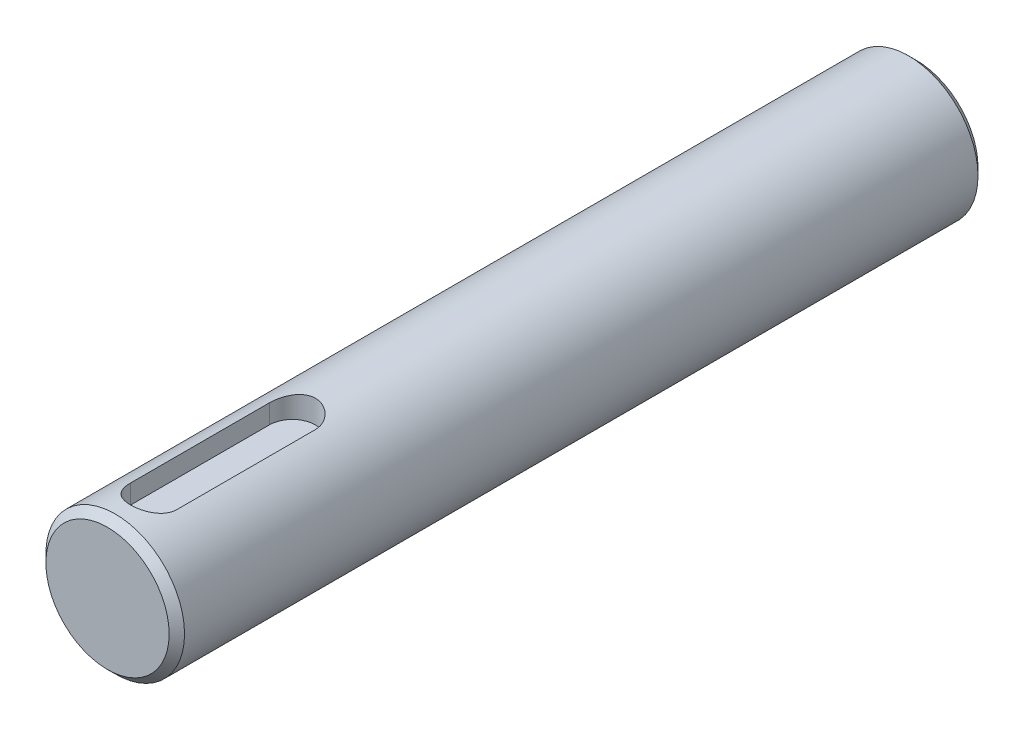
ISO-10303-21;
HEADER;
FILE_DESCRIPTION(('STEP AP214'),'2;1');
FILE_NAME('part.step','',(''),(''),'','','');
FILE_SCHEMA(('AUTOMOTIVE_DESIGN { 1 0 10303 214 1 1 1 1 }'));
ENDSEC;
DATA;
#1=APPLICATION_CONTEXT('core data for automotive mechanical design processes');
#2=APPLICATION_PROTOCOL_DEFINITION('international standard','automotive_design',2000,#1);
#3=PRODUCT_CONTEXT('',#1,'mechanical');
#4=PRODUCT('Part','Part','',(#3));
#5=PRODUCT_RELATED_PRODUCT_CATEGORY('part','',(#4));
#6=PRODUCT_DEFINITION_FORMATION('','',#4);
#7=PRODUCT_DEFINITION_CONTEXT('part definition',#1,'design');
#8=PRODUCT_DEFINITION('design','',#6,#7);
#9=PRODUCT_DEFINITION_SHAPE('','',#8);
#10=(LENGTH_UNIT() NAMED_UNIT(*) SI_UNIT(.MILLI.,.METRE.));
#11=(NAMED_UNIT(*) PLANE_ANGLE_UNIT() SI_UNIT($,.RADIAN.));
#12=(NAMED_UNIT(*) SI_UNIT($,.STERADIAN.) SOLID_ANGLE_UNIT());
#13=UNCERTAINTY_MEASURE_WITH_UNIT(LENGTH_MEASURE(1.E-05),#10,'distance_accuracy_value','');
#14=(GEOMETRIC_REPRESENTATION_CONTEXT(3) GLOBAL_UNCERTAINTY_ASSIGNED_CONTEXT((#13)) GLOBAL_UNIT_ASSIGNED_CONTEXT((#10,
#11,#12)) REPRESENTATION_CONTEXT('',''));
#15=CARTESIAN_POINT('',(0.,0.,0.));
#16=DIRECTION('',(0.,0.,1.));
#17=DIRECTION('',(1.,0.,0.));
#18=AXIS2_PLACEMENT_3D('',#15,#16,#17);
#19=CARTESIAN_POINT('',(0.,0.,105.));
#20=DIRECTION('',(0.,0.,-1.));
#21=DIRECTION('',(-1.,0.,0.));
#22=AXIS2_PLACEMENT_3D('',#19,#20,#21);
#23=CYLINDRICAL_SURFACE('',#22,9.);
#24=CARTESIAN_POINT('',(0.,0.,0.999999999999973));
#25=DIRECTION('',(0.,0.,1.));
#26=DIRECTION('',(1.,0.,0.));
#27=AXIS2_PLACEMENT_3D('',#24,#25,#26);
#28=CIRCLE('',#27,9.);
#29=CARTESIAN_POINT('',(9.,0.,0.999999999999973));
#30=VERTEX_POINT('',#29);
#31=EDGE_CURVE('E128',#30,#30,#28,.T.);
#32=ORIENTED_EDGE('',*,*,#31,.T.);
#33=EDGE_LOOP('',(#32));
#34=FACE_BOUND('',#33,.T.);
#35=CARTESIAN_POINT('',(0.,0.,104.));
#36=DIRECTION('',(0.,0.,1.));
#37=DIRECTION('',(1.,0.,0.));
#38=AXIS2_PLACEMENT_3D('',#35,#36,#37);
#39=CIRCLE('',#38,9.);
#40=CARTESIAN_POINT('',(9.,0.,104.));
#41=VERTEX_POINT('',#40);
#42=EDGE_CURVE('E95',#41,#41,#39,.F.);
#43=ORIENTED_EDGE('',*,*,#42,.T.);
#44=EDGE_LOOP('',(#43));
#45=FACE_BOUND('',#44,.T.);
#46=CARTESIAN_POINT('',(-3.,8.48528137423857,99.));
#47=CARTESIAN_POINT('',(-3.00001078932486,8.48526831927789,99.0818484933844));
#48=CARTESIAN_POINT('',(-2.99665064665901,8.48646532685483,99.1636896896105));
#49=CARTESIAN_POINT('',(-2.98327254936564,8.49118228945209,99.3267372460191));
#50=CARTESIAN_POINT('',(-2.97325639196642,8.49470161740771,99.4079437715856));
#51=CARTESIAN_POINT('',(-2.94668951307354,8.50395246303008,99.5689085860254));
#52=CARTESIAN_POINT('',(-2.93015817315761,8.50967741820142,99.648670443061));
#53=CARTESIAN_POINT('',(-2.89073017236144,8.52315143887203,99.8064099222994));
#54=CARTESIAN_POINT('',(-2.8678332814324,8.53090057752397,99.884387479908));
#55=CARTESIAN_POINT('',(-2.7898986156743,8.55683928952694,100.114753895657));
#56=CARTESIAN_POINT('',(-2.72557700172275,8.57773492660859,100.263814988963));
#57=CARTESIAN_POINT('',(-2.57421340927529,8.62436440905027,100.549052173757));
#58=CARTESIAN_POINT('',(-2.4871574792233,8.65010122261302,100.685220282941));
#59=CARTESIAN_POINT('',(-2.28915595016085,8.70463418867365,100.94615148416));
#60=CARTESIAN_POINT('',(-2.17747541556634,8.73350627313643,101.070342171302));
#61=CARTESIAN_POINT('',(-1.93496485428979,8.79041552071283,101.2986205239));
#62=CARTESIAN_POINT('',(-1.80413142497752,8.81845253440363,101.402704609656));
#63=CARTESIAN_POINT('',(-1.52281106991367,8.87141647315468,101.59043786904));
#64=CARTESIAN_POINT('',(-1.37190030336069,8.8962431223892,101.673482769007));
#65=CARTESIAN_POINT('',(-1.05728771462316,8.9390882626048,101.812776939205));
#66=CARTESIAN_POINT('',(-0.893589817668319,8.95710883299482,101.869034394971));
#67=CARTESIAN_POINT('',(-0.564088045229084,8.98377213313373,101.951207130487));
#68=CARTESIAN_POINT('',(-0.398555505085337,8.99271926928151,101.978109801392));
#69=CARTESIAN_POINT('',(-0.0650969066624177,9.0013082524901,102.003948911842));
#70=CARTESIAN_POINT('',(0.102828571762974,9.00095231678788,102.002892015099));
#71=CARTESIAN_POINT('',(0.429311537733991,8.99118115872284,101.973467134069));
#72=CARTESIAN_POINT('',(0.587978116884625,8.98212182877037,101.946172035994));
#73=CARTESIAN_POINT('',(0.898332184121465,8.9564088159923,101.866820454108));
#74=CARTESIAN_POINT('',(1.05001928471038,8.93975471206725,101.814762597295));
#75=CARTESIAN_POINT('',(1.34445790368094,8.90027004455731,101.686735704865));
#76=CARTESIAN_POINT('',(1.48706564697704,8.8773611217211,101.610461165856));
#77=CARTESIAN_POINT('',(1.75777363724201,8.82775164383326,101.436420844795));
#78=CARTESIAN_POINT('',(1.88586992347829,8.80105005807909,101.338649216676));
#79=CARTESIAN_POINT('',(2.13029252762403,8.74518810577395,101.118984117542));
#80=CARTESIAN_POINT('',(2.24578277403273,8.71597116015319,100.996172948676));
#81=CARTESIAN_POINT('',(2.45481413464109,8.65942491449435,100.732685954708));
#82=CARTESIAN_POINT('',(2.5483481578384,8.63209622629495,100.592004380708));
#83=CARTESIAN_POINT('',(2.71201733554396,8.58210018141277,100.293919921764));
#84=CARTESIAN_POINT('',(2.78178668333576,8.55950759277136,100.136300848881));
#85=CARTESIAN_POINT('',(2.86551808116445,8.5316849132946,99.8923158654452));
#86=CARTESIAN_POINT('',(2.889939000529,8.52342263559069,99.8097432429298));
#87=CARTESIAN_POINT('',(2.9316254907929,8.50917513666655,99.6426296037896));
#88=CARTESIAN_POINT('',(2.94889432902108,8.50318887578236,99.5580895046639));
#89=CARTESIAN_POINT('',(2.97496555991273,8.49410161473166,99.3947667222494));
#90=CARTESIAN_POINT('',(2.98435073218189,8.49080270505212,99.3160871393639));
#91=CARTESIAN_POINT('',(2.99686829404165,8.48638843638536,99.1582744704951));
#92=CARTESIAN_POINT('',(3.0000087520931,8.48527025982562,99.0791421023582));
#93=CARTESIAN_POINT('',(3.,8.48528137423857,99.));
#94=B_SPLINE_CURVE_WITH_KNOTS('',3,(#46,#47,#48,#49,#50,#51,#52,#53,#54,#55,#56,#57,#58,#59,#60,
#61,#62,#63,#64,#65,#66,#67,#68,#69,#70,#71,#72,#73,#74,#75,#76,#77,#78,#79,#80,#81,#82,#83,#84,
#85,#86,#87,#88,#89,#90,#91,#92,#93),.UNSPECIFIED.,.F.,.F.,(4,2,2,2,2,2,2,2,2,2,2,2,2,2,2,2,2,2,
2,2,2,2,2,4),(0.,0.245455454206294,0.490844658508378,0.735509315314893,0.980182815366468,
1.46881220307906,1.95774215958629,2.46393436906068,2.97021661609276,3.48971320817339,
4.00905095381417,4.51032334200243,5.01147626109962,5.4929717741524,5.97449398742779,
6.46234978495937,6.9503384178434,7.46126084192184,7.97234804765762,8.49098011802155,
8.75020549988895,9.0093123272696,9.24695816264698,9.48429674853612),.UNSPECIFIED.);
#95=CARTESIAN_POINT('',(-3.,8.48528137423857,99.));
#96=VERTEX_POINT('',#95);
#97=CARTESIAN_POINT('',(3.,8.48528137423857,99.));
#98=VERTEX_POINT('',#97);
#99=EDGE_CURVE('E140',#96,#98,#94,.T.);
#100=ORIENTED_EDGE('',*,*,#99,.F.);
#101=DIRECTION('',(0.,0.,-1.));
#102=VECTOR('',#101,1.);
#103=CARTESIAN_POINT('',(-3.,8.48528137423857,105.));
#104=LINE('',#103,#102);
#105=CARTESIAN_POINT('',(-3.,8.48528137423857,81.));
#106=VERTEX_POINT('',#105);
#107=EDGE_CURVE('E11',#106,#96,#104,.F.);
#108=ORIENTED_EDGE('',*,*,#107,.F.);
#109=CARTESIAN_POINT('',(3.,8.48528137423857,81.));
#110=CARTESIAN_POINT('',(3.00001078932486,8.48526831927789,80.9181515066156));
#111=CARTESIAN_POINT('',(2.99665064665902,8.48646532685483,80.8363103103895));
#112=CARTESIAN_POINT('',(2.98327254936565,8.49118228945209,80.6732627539809));
#113=CARTESIAN_POINT('',(2.97325639196643,8.49470161740771,80.5920562284143));
#114=CARTESIAN_POINT('',(2.94668951307354,8.50395246303008,80.4310914139745));
#115=CARTESIAN_POINT('',(2.93015817315762,8.50967741820142,80.351329556939));
#116=CARTESIAN_POINT('',(2.89073017236145,8.52315143887203,80.1935900777006));
#117=CARTESIAN_POINT('',(2.86783328143241,8.53090057752397,80.115612520092));
#118=CARTESIAN_POINT('',(2.7898986156743,8.55683928952694,79.8852461043427));
#119=CARTESIAN_POINT('',(2.72557700172276,8.57773492660859,79.7361850110373));
#120=CARTESIAN_POINT('',(2.5742134092753,8.62436440905027,79.4509478262426));
#121=CARTESIAN_POINT('',(2.4871574792233,8.65010122261302,79.3147797170588));
#122=CARTESIAN_POINT('',(2.28915595016086,8.70463418867365,79.0538485158402));
#123=CARTESIAN_POINT('',(2.17747541556634,8.73350627313643,78.9296578286977));
#124=CARTESIAN_POINT('',(1.93496485428979,8.79041552071283,78.7013794761));
#125=CARTESIAN_POINT('',(1.80413142497752,8.81845253440362,78.5972953903439));
#126=CARTESIAN_POINT('',(1.52281106991368,8.87141647315468,78.4095621309602));
#127=CARTESIAN_POINT('',(1.37190030336069,8.8962431223892,78.3265172309932));
#128=CARTESIAN_POINT('',(1.05728771462316,8.9390882626048,78.1872230607945));
#129=CARTESIAN_POINT('',(0.893589817668321,8.95710883299482,78.1309656050291));
#130=CARTESIAN_POINT('',(0.564088045229087,8.98377213313373,78.0487928695132));
#131=CARTESIAN_POINT('',(0.39855550508534,8.99271926928151,78.0218901986083));
#132=CARTESIAN_POINT('',(0.0650969066624235,9.0013082524901,77.9960510881577));
#133=CARTESIAN_POINT('',(-0.102828571762967,9.00095231678788,77.9971079849012));
#134=CARTESIAN_POINT('',(-0.429311537733983,8.99118115872284,78.0265328659313));
#135=CARTESIAN_POINT('',(-0.587978116884617,8.98212182877037,78.0538279640061));
#136=CARTESIAN_POINT('',(-0.898332184121459,8.9564088159923,78.1331795458919));
#137=CARTESIAN_POINT('',(-1.05001928471038,8.93975471206725,78.1852374027045));
#138=CARTESIAN_POINT('',(-1.34445790368094,8.9002700445573,78.3132642951352));
#139=CARTESIAN_POINT('',(-1.48706564697704,8.87736112172109,78.3895388341441));
#140=CARTESIAN_POINT('',(-1.75777363724201,8.82775164383326,78.5635791552047));
#141=CARTESIAN_POINT('',(-1.88586992347829,8.80105005807909,78.6613507833241));
#142=CARTESIAN_POINT('',(-2.13029252762403,8.74518810577395,78.8810158824584));
#143=CARTESIAN_POINT('',(-2.24578277403273,8.71597116015319,79.0038270513244));
#144=CARTESIAN_POINT('',(-2.45481413464109,8.65942491449435,79.2673140452924));
#145=CARTESIAN_POINT('',(-2.5483481578384,8.63209622629495,79.4079956192924));
#146=CARTESIAN_POINT('',(-2.71201733554396,8.58210018141277,79.7060800782364));
#147=CARTESIAN_POINT('',(-2.78178668333576,8.55950759277136,79.8636991511186));
#148=CARTESIAN_POINT('',(-2.86551808116445,8.5316849132946,80.1076841345548));
#149=CARTESIAN_POINT('',(-2.889939000529,8.52342263559069,80.1902567570702));
#150=CARTESIAN_POINT('',(-2.93162549079289,8.50917513666655,80.3573703962104));
#151=CARTESIAN_POINT('',(-2.94889432902107,8.50318887578236,80.4419104953361));
#152=CARTESIAN_POINT('',(-2.97496555991272,8.49410161473166,80.6052332777506));
#153=CARTESIAN_POINT('',(-2.98435073218189,8.49080270505212,80.6839128606361));
#154=CARTESIAN_POINT('',(-2.99686829404165,8.48638843638536,80.8417255295049));
#155=CARTESIAN_POINT('',(-3.00000875209309,8.48527025982562,80.9208578976418));
#156=CARTESIAN_POINT('',(-3.,8.48528137423857,81.));
#157=B_SPLINE_CURVE_WITH_KNOTS('',3,(#109,#110,#111,#112,#113,#114,#115,#116,#117,#118,#119,
#120,#121,#122,#123,#124,#125,#126,#127,#128,#129,#130,#131,#132,#133,#134,#135,#136,#137,#138,
#139,#140,#141,#142,#143,#144,#145,#146,#147,#148,#149,#150,#151,#152,#153,#154,#155,#156),
.UNSPECIFIED.,.F.,.F.,(4,2,2,2,2,2,2,2,2,2,2,2,2,2,2,2,2,2,2,2,2,2,2,4),(0.,0.245455454206294,
0.490844658508378,0.735509315314879,0.980182815366468,1.46881220307906,1.95774215958628,
2.46393436906068,2.97021661609276,3.48971320817339,4.00905095381417,4.51032334200243,
5.01147626109961,5.4929717741524,5.97449398742778,6.46234978495938,6.9503384178434,
7.46126084192185,7.97234804765762,8.49098011802155,8.75020549988896,9.00931232726959,
9.24695816264697,9.48429674853611),.UNSPECIFIED.);
#158=CARTESIAN_POINT('',(3.,8.48528137423857,81.));
#159=VERTEX_POINT('',#158);
#160=EDGE_CURVE('E70',#159,#106,#157,.T.);
#161=ORIENTED_EDGE('',*,*,#160,.F.);
#162=DIRECTION('',(0.,0.,-1.));
#163=VECTOR('',#162,1.);
#164=CARTESIAN_POINT('',(3.,8.48528137423857,105.));
#165=LINE('',#164,#163);
#166=EDGE_CURVE('E55',#98,#159,#165,.T.);
#167=ORIENTED_EDGE('',*,*,#166,.F.);
#168=EDGE_LOOP('',(#100,#108,#161,#167));
#169=FACE_BOUND('',#168,.T.);
#170=ADVANCED_FACE('F45',(#34,#45,#169),#23,.T.);
#171=CARTESIAN_POINT('',(0.,0.,105.));
#172=DIRECTION('',(0.,0.,1.));
#173=DIRECTION('',(1.,0.,0.));
#174=AXIS2_PLACEMENT_3D('',#171,#172,#173);
#175=PLANE('',#174);
#176=CARTESIAN_POINT('',(0.,0.,105.));
#177=DIRECTION('',(0.,0.,1.));
#178=DIRECTION('',(1.,0.,0.));
#179=AXIS2_PLACEMENT_3D('',#176,#177,#178);
#180=CIRCLE('',#179,7.99999999999999);
#181=CARTESIAN_POINT('',(7.99999999999999,0.,105.));
#182=VERTEX_POINT('',#181);
#183=EDGE_CURVE('E136',#182,#182,#180,.T.);
#184=ORIENTED_EDGE('',*,*,#183,.T.);
#185=EDGE_LOOP('',(#184));
#186=FACE_BOUND('',#185,.T.);
#187=ADVANCED_FACE('F168',(#186),#175,.T.);
#188=CARTESIAN_POINT('',(0.,0.,0.));
#189=DIRECTION('',(0.,0.,1.));
#190=DIRECTION('',(1.,0.,0.));
#191=AXIS2_PLACEMENT_3D('',#188,#189,#190);
#192=PLANE('',#191);
#193=CARTESIAN_POINT('',(0.,0.,0.));
#194=DIRECTION('',(0.,0.,1.));
#195=DIRECTION('',(1.,0.,0.));
#196=AXIS2_PLACEMENT_3D('',#193,#194,#195);
#197=CIRCLE('',#196,8.00000000000002);
#198=CARTESIAN_POINT('',(8.00000000000002,0.,0.));
#199=VERTEX_POINT('',#198);
#200=EDGE_CURVE('E132',#199,#199,#197,.F.);
#201=ORIENTED_EDGE('',*,*,#200,.T.);
#202=EDGE_LOOP('',(#201));
#203=FACE_BOUND('',#202,.T.);
#204=ADVANCED_FACE('F170',(#203),#192,.F.);
#205=CARTESIAN_POINT('',(0.,0.,0.999999999999973));
#206=DIRECTION('',(0.,0.,1.));
#207=DIRECTION('',(1.,0.,0.));
#208=AXIS2_PLACEMENT_3D('',#205,#206,#207);
#209=CONICAL_SURFACE('',#208,9.,0.785398163397451);
#210=ORIENTED_EDGE('',*,*,#200,.F.);
#211=EDGE_LOOP('',(#210));
#212=FACE_BOUND('',#211,.T.);
#213=ORIENTED_EDGE('',*,*,#31,.F.);
#214=EDGE_LOOP('',(#213));
#215=FACE_BOUND('',#214,.T.);
#216=ADVANCED_FACE('F173',(#212,#215),#209,.T.);
#217=CARTESIAN_POINT('',(0.,0.,105.));
#218=DIRECTION('',(0.,0.,-1.));
#219=DIRECTION('',(-1.,0.,0.));
#220=AXIS2_PLACEMENT_3D('',#217,#218,#219);
#221=CONICAL_SURFACE('',#220,7.99999999999999,0.785398163397444);
#222=ORIENTED_EDGE('',*,*,#42,.F.);
#223=EDGE_LOOP('',(#222));
#224=FACE_BOUND('',#223,.T.);
#225=ORIENTED_EDGE('',*,*,#183,.F.);
#226=EDGE_LOOP('',(#225));
#227=FACE_BOUND('',#226,.T.);
#228=ADVANCED_FACE('F48',(#224,#227),#221,.T.);
#229=CARTESIAN_POINT('',(0.,9.,81.));
#230=DIRECTION('',(0.,-1.,0.));
#231=DIRECTION('',(0.,0.,-1.));
#232=AXIS2_PLACEMENT_3D('',#229,#230,#231);
#233=CYLINDRICAL_SURFACE('',#232,3.);
#234=DIRECTION('',(0.,-1.,0.));
#235=VECTOR('',#234,1.);
#236=CARTESIAN_POINT('',(3.,9.,81.));
#237=LINE('',#236,#235);
#238=CARTESIAN_POINT('',(3.,6.,81.));
#239=VERTEX_POINT('',#238);
#240=EDGE_CURVE('E118',#159,#239,#237,.T.);
#241=ORIENTED_EDGE('',*,*,#240,.F.);
#242=ORIENTED_EDGE('',*,*,#160,.T.);
#243=DIRECTION('',(0.,-1.,0.));
#244=VECTOR('',#243,1.);
#245=CARTESIAN_POINT('',(-3.,9.,81.));
#246=LINE('',#245,#244);
#247=CARTESIAN_POINT('',(-3.,6.,81.));
#248=VERTEX_POINT('',#247);
#249=EDGE_CURVE('E87',#106,#248,#246,.T.);
#250=ORIENTED_EDGE('',*,*,#249,.T.);
#251=CARTESIAN_POINT('',(0.,6.,81.));
#252=DIRECTION('',(0.,1.,0.));
#253=DIRECTION('',(0.,0.,1.));
#254=AXIS2_PLACEMENT_3D('',#251,#252,#253);
#255=CIRCLE('',#254,3.);
#256=EDGE_CURVE('E91',#239,#248,#255,.T.);
#257=ORIENTED_EDGE('',*,*,#256,.F.);
#258=EDGE_LOOP('',(#241,#242,#250,#257));
#259=FACE_BOUND('',#258,.T.);
#260=ADVANCED_FACE('F89',(#259),#233,.F.);
#261=CARTESIAN_POINT('',(-3.,9.,81.));
#262=DIRECTION('',(1.,0.,0.));
#263=DIRECTION('',(0.,0.,-1.));
#264=AXIS2_PLACEMENT_3D('',#261,#262,#263);
#265=PLANE('',#264);
#266=ORIENTED_EDGE('',*,*,#107,.T.);
#267=DIRECTION('',(0.,-1.,0.));
#268=VECTOR('',#267,1.);
#269=CARTESIAN_POINT('',(-3.,9.,99.));
#270=LINE('',#269,#268);
#271=CARTESIAN_POINT('',(-3.,6.,99.));
#272=VERTEX_POINT('',#271);
#273=EDGE_CURVE('E96',#96,#272,#270,.T.);
#274=ORIENTED_EDGE('',*,*,#273,.T.);
#275=DIRECTION('',(0.,0.,1.));
#276=VECTOR('',#275,1.);
#277=CARTESIAN_POINT('',(-3.,6.,81.));
#278=LINE('',#277,#276);
#279=EDGE_CURVE('E99',#248,#272,#278,.T.);
#280=ORIENTED_EDGE('',*,*,#279,.F.);
#281=ORIENTED_EDGE('',*,*,#249,.F.);
#282=EDGE_LOOP('',(#266,#274,#280,#281));
#283=FACE_BOUND('',#282,.T.);
#284=ADVANCED_FACE('F100',(#283),#265,.T.);
#285=CARTESIAN_POINT('',(0.,9.,99.));
#286=DIRECTION('',(0.,-1.,0.));
#287=DIRECTION('',(0.,0.,-1.));
#288=AXIS2_PLACEMENT_3D('',#285,#286,#287);
#289=CYLINDRICAL_SURFACE('',#288,3.);
#290=ORIENTED_EDGE('',*,*,#273,.F.);
#291=ORIENTED_EDGE('',*,*,#99,.T.);
#292=DIRECTION('',(0.,-1.,0.));
#293=VECTOR('',#292,1.);
#294=CARTESIAN_POINT('',(3.,9.,99.));
#295=LINE('',#294,#293);
#296=CARTESIAN_POINT('',(3.,6.,99.));
#297=VERTEX_POINT('',#296);
#298=EDGE_CURVE('E62',#98,#297,#295,.T.);
#299=ORIENTED_EDGE('',*,*,#298,.T.);
#300=CARTESIAN_POINT('',(0.,6.,99.));
#301=DIRECTION('',(0.,1.,0.));
#302=DIRECTION('',(0.,0.,1.));
#303=AXIS2_PLACEMENT_3D('',#300,#301,#302);
#304=CIRCLE('',#303,3.);
#305=EDGE_CURVE('E106',#272,#297,#304,.T.);
#306=ORIENTED_EDGE('',*,*,#305,.F.);
#307=EDGE_LOOP('',(#290,#291,#299,#306));
#308=FACE_BOUND('',#307,.T.);
#309=ADVANCED_FACE('F156',(#308),#289,.F.);
#310=CARTESIAN_POINT('',(3.,9.,81.));
#311=DIRECTION('',(-1.,0.,0.));
#312=DIRECTION('',(0.,0.,1.));
#313=AXIS2_PLACEMENT_3D('',#310,#311,#312);
#314=PLANE('',#313);
#315=ORIENTED_EDGE('',*,*,#166,.T.);
#316=ORIENTED_EDGE('',*,*,#240,.T.);
#317=DIRECTION('',(0.,0.,-1.));
#318=VECTOR('',#317,1.);
#319=CARTESIAN_POINT('',(3.,6.,81.));
#320=LINE('',#319,#318);
#321=EDGE_CURVE('E110',#297,#239,#320,.T.);
#322=ORIENTED_EDGE('',*,*,#321,.F.);
#323=ORIENTED_EDGE('',*,*,#298,.F.);
#324=EDGE_LOOP('',(#315,#316,#322,#323));
#325=FACE_BOUND('',#324,.T.);
#326=ADVANCED_FACE('F161',(#325),#314,.T.);
#327=CARTESIAN_POINT('',(0.,6.,81.));
#328=DIRECTION('',(0.,1.,0.));
#329=DIRECTION('',(0.,0.,1.));
#330=AXIS2_PLACEMENT_3D('',#327,#328,#329);
#331=PLANE('',#330);
#332=ORIENTED_EDGE('',*,*,#256,.T.);
#333=ORIENTED_EDGE('',*,*,#279,.T.);
#334=ORIENTED_EDGE('',*,*,#305,.T.);
#335=ORIENTED_EDGE('',*,*,#321,.T.);
#336=EDGE_LOOP('',(#332,#333,#334,#335));
#337=FACE_BOUND('',#336,.T.);
#338=ADVANCED_FACE('F109',(#337),#331,.T.);
#339=CLOSED_SHELL('',(#170,#187,#204,#216,#228,#260,#284,#309,#326,#338));
#340=MANIFOLD_SOLID_BREP('B2',#339);
#341=ADVANCED_BREP_SHAPE_REPRESENTATION('',(#18,#340),#14);
#342=SHAPE_DEFINITION_REPRESENTATION(#9,#341);
ENDSEC;
END-ISO-10303-21;
